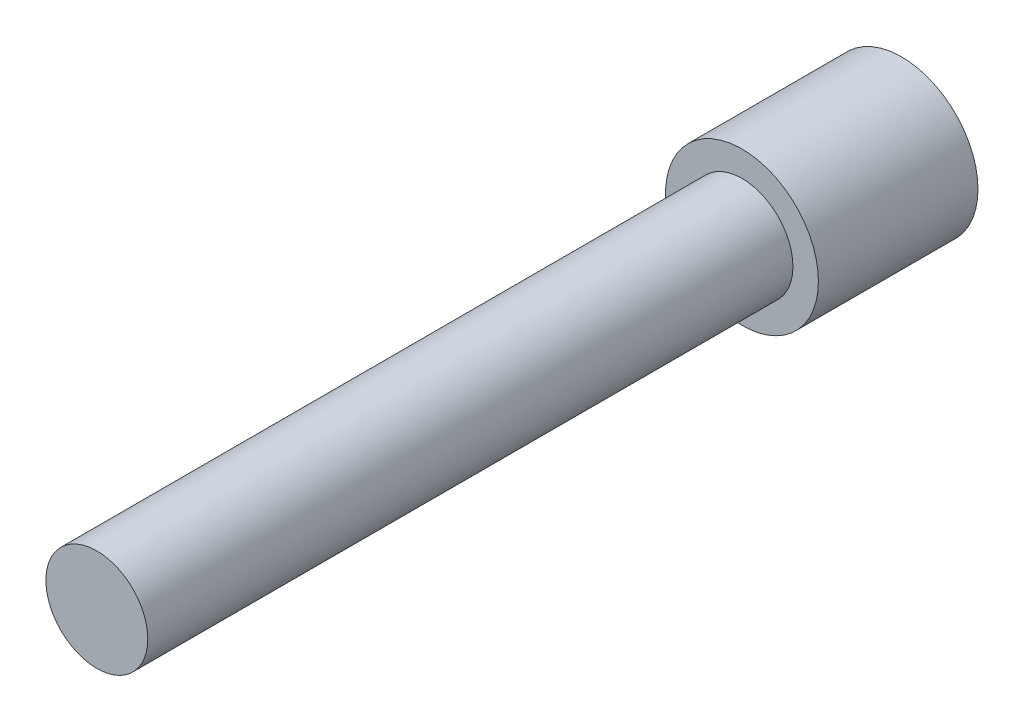
ISO-10303-21;
HEADER;
FILE_DESCRIPTION(('STEP AP214'),'2;1');
FILE_NAME('part.step','',(''),(''),'','','');
FILE_SCHEMA(('AUTOMOTIVE_DESIGN { 1 0 10303 214 1 1 1 1 }'));
ENDSEC;
DATA;
#1=APPLICATION_CONTEXT('core data for automotive mechanical design processes');
#2=APPLICATION_PROTOCOL_DEFINITION('international standard','automotive_design',2000,#1);
#3=PRODUCT_CONTEXT('',#1,'mechanical');
#4=PRODUCT('Part','Part','',(#3));
#5=PRODUCT_RELATED_PRODUCT_CATEGORY('part','',(#4));
#6=PRODUCT_DEFINITION_FORMATION('','',#4);
#7=PRODUCT_DEFINITION_CONTEXT('part definition',#1,'design');
#8=PRODUCT_DEFINITION('design','',#6,#7);
#9=PRODUCT_DEFINITION_SHAPE('','',#8);
#10=(LENGTH_UNIT() NAMED_UNIT(*) SI_UNIT(.MILLI.,.METRE.));
#11=(NAMED_UNIT(*) PLANE_ANGLE_UNIT() SI_UNIT($,.RADIAN.));
#12=(NAMED_UNIT(*) SI_UNIT($,.STERADIAN.) SOLID_ANGLE_UNIT());
#13=UNCERTAINTY_MEASURE_WITH_UNIT(LENGTH_MEASURE(1.E-05),#10,'distance_accuracy_value','');
#14=(GEOMETRIC_REPRESENTATION_CONTEXT(3) GLOBAL_UNCERTAINTY_ASSIGNED_CONTEXT((#13)) GLOBAL_UNIT_ASSIGNED_CONTEXT((#10,
#11,#12)) REPRESENTATION_CONTEXT('',''));
#15=CARTESIAN_POINT('',(0.,0.,0.));
#16=DIRECTION('',(0.,0.,1.));
#17=DIRECTION('',(1.,0.,0.));
#18=AXIS2_PLACEMENT_3D('',#15,#16,#17);
#19=CARTESIAN_POINT('',(0.,0.,4.7));
#20=DIRECTION('',(0.,0.,1.));
#21=DIRECTION('',(1.,0.,0.));
#22=AXIS2_PLACEMENT_3D('',#19,#20,#21);
#23=PLANE('',#22);
#24=CARTESIAN_POINT('',(0.,0.,4.7));
#25=DIRECTION('',(0.,0.,1.));
#26=DIRECTION('',(1.,0.,0.));
#27=AXIS2_PLACEMENT_3D('',#24,#25,#26);
#28=CIRCLE('',#27,2.25);
#29=CARTESIAN_POINT('',(2.25,0.,4.7));
#30=VERTEX_POINT('',#29);
#31=EDGE_CURVE('E12',#30,#30,#28,.T.);
#32=ORIENTED_EDGE('',*,*,#31,.T.);
#33=EDGE_LOOP('',(#32));
#34=FACE_BOUND('',#33,.T.);
#35=CARTESIAN_POINT('',(0.,0.,4.7));
#36=DIRECTION('',(0.,0.,1.));
#37=DIRECTION('',(1.,0.,0.));
#38=AXIS2_PLACEMENT_3D('',#35,#36,#37);
#39=CIRCLE('',#38,1.5);
#40=CARTESIAN_POINT('',(1.5,0.,4.7));
#41=VERTEX_POINT('',#40);
#42=EDGE_CURVE('E60',#41,#41,#39,.T.);
#43=ORIENTED_EDGE('',*,*,#42,.F.);
#44=EDGE_LOOP('',(#43));
#45=FACE_BOUND('',#44,.T.);
#46=ADVANCED_FACE('F47',(#34,#45),#23,.T.);
#47=CARTESIAN_POINT('',(0.,0.,4.7));
#48=DIRECTION('',(0.,0.,-1.));
#49=DIRECTION('',(-1.,0.,0.));
#50=AXIS2_PLACEMENT_3D('',#47,#48,#49);
#51=CYLINDRICAL_SURFACE('',#50,2.25);
#52=ORIENTED_EDGE('',*,*,#31,.F.);
#53=EDGE_LOOP('',(#52));
#54=FACE_BOUND('',#53,.T.);
#55=CARTESIAN_POINT('',(0.,0.,0.));
#56=DIRECTION('',(0.,0.,1.));
#57=DIRECTION('',(1.,0.,0.));
#58=AXIS2_PLACEMENT_3D('',#55,#56,#57);
#59=CIRCLE('',#58,2.25);
#60=CARTESIAN_POINT('',(2.25,0.,0.));
#61=VERTEX_POINT('',#60);
#62=EDGE_CURVE('E51',#61,#61,#59,.T.);
#63=ORIENTED_EDGE('',*,*,#62,.T.);
#64=EDGE_LOOP('',(#63));
#65=FACE_BOUND('',#64,.T.);
#66=ADVANCED_FACE('F49',(#54,#65),#51,.T.);
#67=CARTESIAN_POINT('',(0.,0.,0.));
#68=DIRECTION('',(0.,0.,1.));
#69=DIRECTION('',(1.,0.,0.));
#70=AXIS2_PLACEMENT_3D('',#67,#68,#69);
#71=PLANE('',#70);
#72=CARTESIAN_POINT('',(0.,0.,0.));
#73=DIRECTION('',(0.,0.,-1.));
#74=DIRECTION('',(-1.,0.,0.));
#75=AXIS2_PLACEMENT_3D('',#72,#73,#74);
#76=CIRCLE('',#75,1.5);
#77=CARTESIAN_POINT('',(-1.5,0.,0.));
#78=VERTEX_POINT('',#77);
#79=EDGE_CURVE('E66',#78,#78,#76,.T.);
#80=ORIENTED_EDGE('',*,*,#79,.F.);
#81=EDGE_LOOP('',(#80));
#82=FACE_BOUND('',#81,.T.);
#83=ORIENTED_EDGE('',*,*,#62,.F.);
#84=EDGE_LOOP('',(#83));
#85=FACE_BOUND('',#84,.T.);
#86=ADVANCED_FACE('F81',(#82,#85),#71,.F.);
#87=CARTESIAN_POINT('',(0.,0.,23.7));
#88=DIRECTION('',(0.,0.,-1.));
#89=DIRECTION('',(-1.,0.,0.));
#90=AXIS2_PLACEMENT_3D('',#87,#88,#89);
#91=CYLINDRICAL_SURFACE('',#90,1.5);
#92=CARTESIAN_POINT('',(0.,0.,23.7));
#93=DIRECTION('',(0.,0.,1.));
#94=DIRECTION('',(1.,0.,0.));
#95=AXIS2_PLACEMENT_3D('',#92,#93,#94);
#96=CIRCLE('',#95,1.5);
#97=CARTESIAN_POINT('',(1.5,0.,23.7));
#98=VERTEX_POINT('',#97);
#99=EDGE_CURVE('E58',#98,#98,#96,.T.);
#100=ORIENTED_EDGE('',*,*,#99,.F.);
#101=EDGE_LOOP('',(#100));
#102=FACE_BOUND('',#101,.T.);
#103=ORIENTED_EDGE('',*,*,#42,.T.);
#104=EDGE_LOOP('',(#103));
#105=FACE_BOUND('',#104,.T.);
#106=ADVANCED_FACE('F84',(#102,#105),#91,.T.);
#107=CARTESIAN_POINT('',(0.,0.,23.7));
#108=DIRECTION('',(0.,0.,1.));
#109=DIRECTION('',(1.,0.,0.));
#110=AXIS2_PLACEMENT_3D('',#107,#108,#109);
#111=PLANE('',#110);
#112=ORIENTED_EDGE('',*,*,#99,.T.);
#113=EDGE_LOOP('',(#112));
#114=FACE_BOUND('',#113,.T.);
#115=ADVANCED_FACE('F77',(#114),#111,.T.);
#116=CARTESIAN_POINT('',(0.,0.,3.));
#117=DIRECTION('',(0.,0.,-1.));
#118=DIRECTION('',(-1.,0.,0.));
#119=AXIS2_PLACEMENT_3D('',#116,#117,#118);
#120=CYLINDRICAL_SURFACE('',#119,1.5);
#121=CARTESIAN_POINT('',(0.,0.,3.));
#122=DIRECTION('',(0.,0.,-1.));
#123=DIRECTION('',(-1.,0.,0.));
#124=AXIS2_PLACEMENT_3D('',#121,#122,#123);
#125=CIRCLE('',#124,1.5);
#126=CARTESIAN_POINT('',(-1.5,0.,3.));
#127=VERTEX_POINT('',#126);
#128=EDGE_CURVE('E63',#127,#127,#125,.T.);
#129=ORIENTED_EDGE('',*,*,#128,.F.);
#130=EDGE_LOOP('',(#129));
#131=FACE_BOUND('',#130,.T.);
#132=ORIENTED_EDGE('',*,*,#79,.T.);
#133=EDGE_LOOP('',(#132));
#134=FACE_BOUND('',#133,.T.);
#135=ADVANCED_FACE('F74',(#131,#134),#120,.F.);
#136=CARTESIAN_POINT('',(0.,0.,3.));
#137=DIRECTION('',(0.,0.,-1.));
#138=DIRECTION('',(-1.,0.,0.));
#139=AXIS2_PLACEMENT_3D('',#136,#137,#138);
#140=PLANE('',#139);
#141=ORIENTED_EDGE('',*,*,#128,.T.);
#142=EDGE_LOOP('',(#141));
#143=FACE_BOUND('',#142,.T.);
#144=ADVANCED_FACE('F72',(#143),#140,.T.);
#145=CLOSED_SHELL('',(#46,#66,#86,#106,#115,#135,#144));
#146=MANIFOLD_SOLID_BREP('B2',#145);
#147=ADVANCED_BREP_SHAPE_REPRESENTATION('',(#18,#146),#14);
#148=SHAPE_DEFINITION_REPRESENTATION(#9,#147);
ENDSEC;
END-ISO-10303-21;
